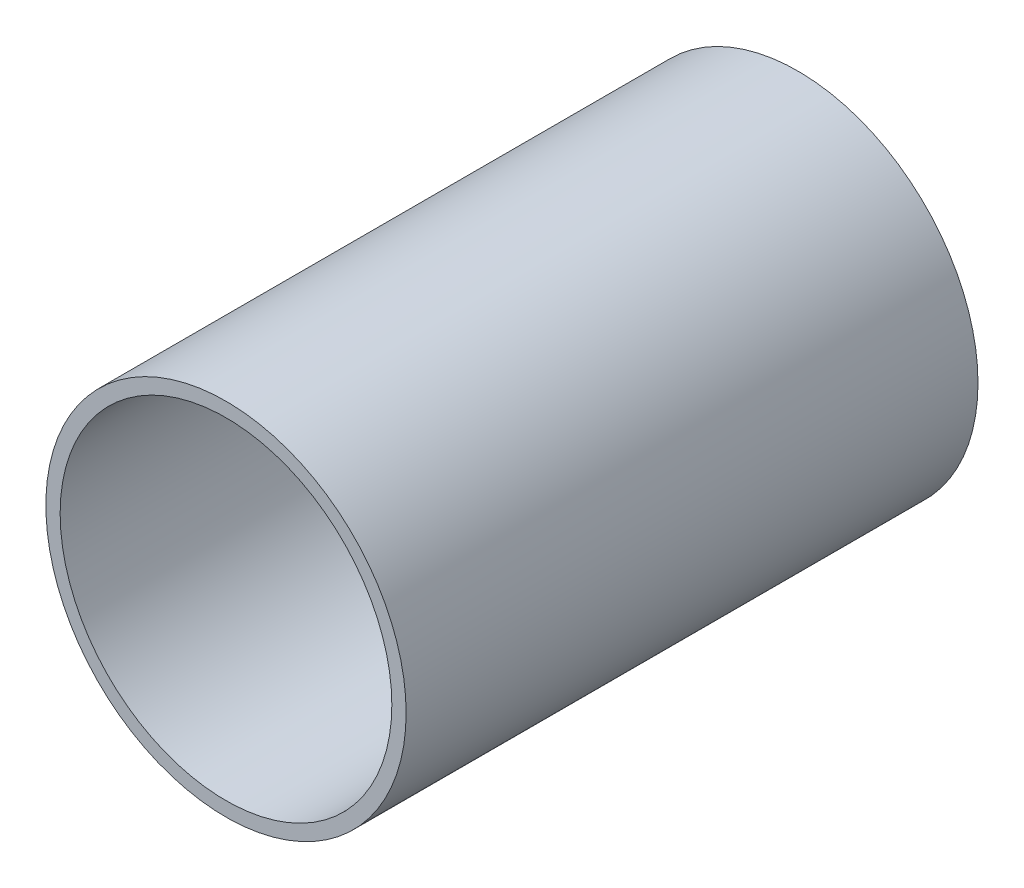
ISO-10303-21;
HEADER;
FILE_DESCRIPTION(('STEP AP214'),'2;1');
FILE_NAME('part.step','',(''),(''),'','','');
FILE_SCHEMA(('AUTOMOTIVE_DESIGN { 1 0 10303 214 1 1 1 1 }'));
ENDSEC;
DATA;
#1=APPLICATION_CONTEXT('core data for automotive mechanical design processes');
#2=APPLICATION_PROTOCOL_DEFINITION('international standard','automotive_design',2000,#1);
#3=PRODUCT_CONTEXT('',#1,'mechanical');
#4=PRODUCT('Part','Part','',(#3));
#5=PRODUCT_RELATED_PRODUCT_CATEGORY('part','',(#4));
#6=PRODUCT_DEFINITION_FORMATION('','',#4);
#7=PRODUCT_DEFINITION_CONTEXT('part definition',#1,'design');
#8=PRODUCT_DEFINITION('design','',#6,#7);
#9=PRODUCT_DEFINITION_SHAPE('','',#8);
#10=(LENGTH_UNIT() NAMED_UNIT(*) SI_UNIT(.MILLI.,.METRE.));
#11=(NAMED_UNIT(*) PLANE_ANGLE_UNIT() SI_UNIT($,.RADIAN.));
#12=(NAMED_UNIT(*) SI_UNIT($,.STERADIAN.) SOLID_ANGLE_UNIT());
#13=UNCERTAINTY_MEASURE_WITH_UNIT(LENGTH_MEASURE(1.E-05),#10,'distance_accuracy_value','');
#14=(GEOMETRIC_REPRESENTATION_CONTEXT(3) GLOBAL_UNCERTAINTY_ASSIGNED_CONTEXT((#13)) GLOBAL_UNIT_ASSIGNED_CONTEXT((#10,
#11,#12)) REPRESENTATION_CONTEXT('',''));
#15=CARTESIAN_POINT('',(0.,0.,0.));
#16=DIRECTION('',(0.,0.,1.));
#17=DIRECTION('',(1.,0.,0.));
#18=AXIS2_PLACEMENT_3D('',#15,#16,#17);
#19=CARTESIAN_POINT('',(0.,0.,100.));
#20=DIRECTION('',(0.,0.,1.));
#21=DIRECTION('',(1.,0.,0.));
#22=AXIS2_PLACEMENT_3D('',#19,#20,#21);
#23=PLANE('',#22);
#24=CARTESIAN_POINT('',(0.,0.,100.));
#25=DIRECTION('',(0.,0.,1.));
#26=DIRECTION('',(1.,0.,0.));
#27=AXIS2_PLACEMENT_3D('',#24,#25,#26);
#28=CIRCLE('',#27,31.5);
#29=CARTESIAN_POINT('',(31.5,0.,100.));
#30=VERTEX_POINT('',#29);
#31=EDGE_CURVE('E10',#30,#30,#28,.T.);
#32=ORIENTED_EDGE('',*,*,#31,.T.);
#33=EDGE_LOOP('',(#32));
#34=FACE_BOUND('',#33,.T.);
#35=CARTESIAN_POINT('',(0.,0.,100.));
#36=DIRECTION('',(0.,0.,1.));
#37=DIRECTION('',(1.,0.,0.));
#38=AXIS2_PLACEMENT_3D('',#35,#36,#37);
#39=CIRCLE('',#38,29.);
#40=CARTESIAN_POINT('',(29.,0.,100.));
#41=VERTEX_POINT('',#40);
#42=EDGE_CURVE('E42',#41,#41,#39,.T.);
#43=ORIENTED_EDGE('',*,*,#42,.F.);
#44=EDGE_LOOP('',(#43));
#45=FACE_BOUND('',#44,.T.);
#46=ADVANCED_FACE('F31',(#34,#45),#23,.T.);
#47=CARTESIAN_POINT('',(0.,0.,0.));
#48=DIRECTION('',(0.,0.,1.));
#49=DIRECTION('',(1.,0.,0.));
#50=AXIS2_PLACEMENT_3D('',#47,#48,#49);
#51=PLANE('',#50);
#52=CARTESIAN_POINT('',(0.,0.,0.));
#53=DIRECTION('',(0.,0.,1.));
#54=DIRECTION('',(1.,0.,0.));
#55=AXIS2_PLACEMENT_3D('',#52,#53,#54);
#56=CIRCLE('',#55,31.5);
#57=CARTESIAN_POINT('',(31.5,0.,0.));
#58=VERTEX_POINT('',#57);
#59=EDGE_CURVE('E35',#58,#58,#56,.T.);
#60=ORIENTED_EDGE('',*,*,#59,.F.);
#61=EDGE_LOOP('',(#60));
#62=FACE_BOUND('',#61,.T.);
#63=CARTESIAN_POINT('',(0.,0.,0.));
#64=DIRECTION('',(0.,0.,1.));
#65=DIRECTION('',(1.,0.,0.));
#66=AXIS2_PLACEMENT_3D('',#63,#64,#65);
#67=CIRCLE('',#66,29.);
#68=CARTESIAN_POINT('',(29.,0.,0.));
#69=VERTEX_POINT('',#68);
#70=EDGE_CURVE('E44',#69,#69,#67,.T.);
#71=ORIENTED_EDGE('',*,*,#70,.T.);
#72=EDGE_LOOP('',(#71));
#73=FACE_BOUND('',#72,.T.);
#74=ADVANCED_FACE('F54',(#62,#73),#51,.F.);
#75=CARTESIAN_POINT('',(0.,0.,100.));
#76=DIRECTION('',(0.,0.,-1.));
#77=DIRECTION('',(-1.,0.,0.));
#78=AXIS2_PLACEMENT_3D('',#75,#76,#77);
#79=CYLINDRICAL_SURFACE('',#78,31.5);
#80=ORIENTED_EDGE('',*,*,#31,.F.);
#81=EDGE_LOOP('',(#80));
#82=FACE_BOUND('',#81,.T.);
#83=ORIENTED_EDGE('',*,*,#59,.T.);
#84=EDGE_LOOP('',(#83));
#85=FACE_BOUND('',#84,.T.);
#86=ADVANCED_FACE('F33',(#82,#85),#79,.T.);
#87=CARTESIAN_POINT('',(0.,0.,100.));
#88=DIRECTION('',(0.,0.,-1.));
#89=DIRECTION('',(-1.,0.,0.));
#90=AXIS2_PLACEMENT_3D('',#87,#88,#89);
#91=CYLINDRICAL_SURFACE('',#90,29.);
#92=ORIENTED_EDGE('',*,*,#42,.T.);
#93=EDGE_LOOP('',(#92));
#94=FACE_BOUND('',#93,.T.);
#95=ORIENTED_EDGE('',*,*,#70,.F.);
#96=EDGE_LOOP('',(#95));
#97=FACE_BOUND('',#96,.T.);
#98=ADVANCED_FACE('F50',(#94,#97),#91,.F.);
#99=CLOSED_SHELL('',(#46,#74,#86,#98));
#100=MANIFOLD_SOLID_BREP('B2',#99);
#101=ADVANCED_BREP_SHAPE_REPRESENTATION('',(#18,#100),#14);
#102=SHAPE_DEFINITION_REPRESENTATION(#9,#101);
ENDSEC;
END-ISO-10303-21;
